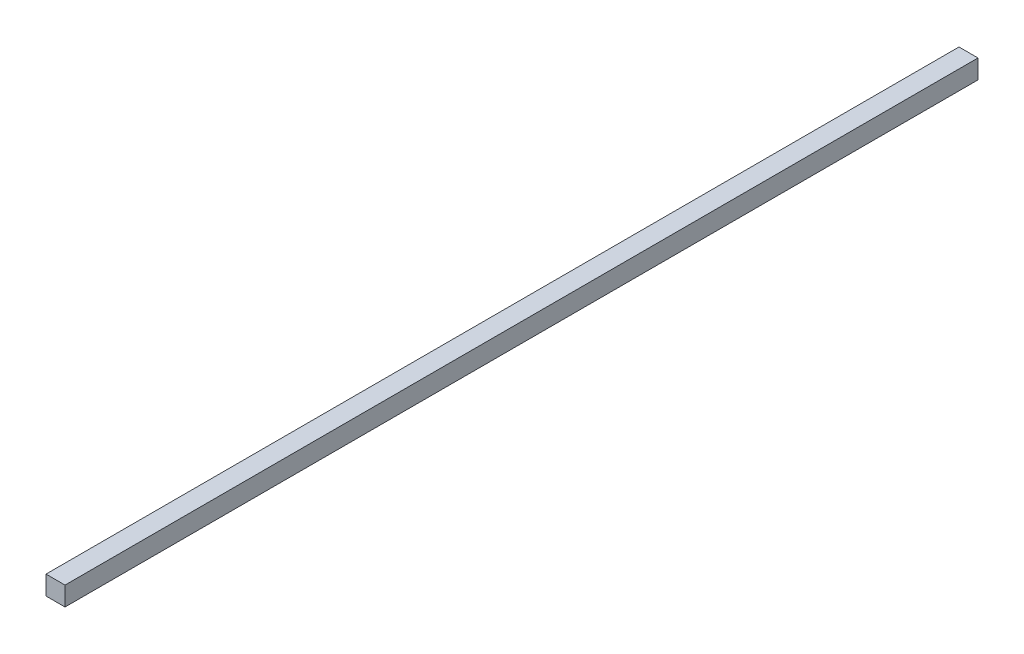
ISO-10303-21;
HEADER;
FILE_DESCRIPTION(('STEP AP214'),'2;1');
FILE_NAME('part.step','',(''),(''),'','','');
FILE_SCHEMA(('AUTOMOTIVE_DESIGN { 1 0 10303 214 1 1 1 1 }'));
ENDSEC;
DATA;
#1=APPLICATION_CONTEXT('core data for automotive mechanical design processes');
#2=APPLICATION_PROTOCOL_DEFINITION('international standard','automotive_design',2000,#1);
#3=PRODUCT_CONTEXT('',#1,'mechanical');
#4=PRODUCT('Part','Part','',(#3));
#5=PRODUCT_RELATED_PRODUCT_CATEGORY('part','',(#4));
#6=PRODUCT_DEFINITION_FORMATION('','',#4);
#7=PRODUCT_DEFINITION_CONTEXT('part definition',#1,'design');
#8=PRODUCT_DEFINITION('design','',#6,#7);
#9=PRODUCT_DEFINITION_SHAPE('','',#8);
#10=(LENGTH_UNIT() NAMED_UNIT(*) SI_UNIT(.MILLI.,.METRE.));
#11=(NAMED_UNIT(*) PLANE_ANGLE_UNIT() SI_UNIT($,.RADIAN.));
#12=(NAMED_UNIT(*) SI_UNIT($,.STERADIAN.) SOLID_ANGLE_UNIT());
#13=UNCERTAINTY_MEASURE_WITH_UNIT(LENGTH_MEASURE(1.E-05),#10,'distance_accuracy_value','');
#14=(GEOMETRIC_REPRESENTATION_CONTEXT(3) GLOBAL_UNCERTAINTY_ASSIGNED_CONTEXT((#13)) GLOBAL_UNIT_ASSIGNED_CONTEXT((#10,
#11,#12)) REPRESENTATION_CONTEXT('',''));
#15=CARTESIAN_POINT('',(0.,0.,0.));
#16=DIRECTION('',(0.,0.,1.));
#17=DIRECTION('',(1.,0.,0.));
#18=AXIS2_PLACEMENT_3D('',#15,#16,#17);
#19=CARTESIAN_POINT('',(1.58750000000007,1.58750000000002,152.4));
#20=DIRECTION('',(-1.00000000000003,0.,0.));
#21=DIRECTION('',(0.,-1.00000000000003,0.));
#22=AXIS2_PLACEMENT_3D('',#19,#20,#21);
#23=PLANE('',#22);
#24=DIRECTION('',(0.,1.00000000000003,0.));
#25=VECTOR('',#24,1.);
#26=CARTESIAN_POINT('',(1.58749999999991,1.58750000000063,6.93889390390723E-13));
#27=LINE('',#26,#25);
#28=CARTESIAN_POINT('',(1.58749999999952,-1.58749999999919,-1.49880108324396E-12));
#29=VERTEX_POINT('',#28);
#30=CARTESIAN_POINT('',(1.58749999999991,1.58750000000063,6.93889390390723E-13));
#31=VERTEX_POINT('',#30);
#32=EDGE_CURVE('E109',#29,#31,#27,.T.);
#33=ORIENTED_EDGE('',*,*,#32,.T.);
#34=DIRECTION('',(0.,0.,-1.));
#35=VECTOR('',#34,1.);
#36=CARTESIAN_POINT('',(1.58750000000007,1.58750000000002,152.4));
#37=LINE('',#36,#35);
#38=CARTESIAN_POINT('',(1.58750000000007,1.58750000000002,152.4));
#39=VERTEX_POINT('',#38);
#40=EDGE_CURVE('E11',#39,#31,#37,.T.);
#41=ORIENTED_EDGE('',*,*,#40,.F.);
#42=DIRECTION('',(0.,1.00000000000003,0.));
#43=VECTOR('',#42,1.);
#44=CARTESIAN_POINT('',(1.58750000000007,1.58750000000002,152.4));
#45=LINE('',#44,#43);
#46=CARTESIAN_POINT('',(1.58749999999958,-1.58749999999935,152.399999999999));
#47=VERTEX_POINT('',#46);
#48=EDGE_CURVE('E92',#47,#39,#45,.T.);
#49=ORIENTED_EDGE('',*,*,#48,.F.);
#50=DIRECTION('',(0.,0.,-1.));
#51=VECTOR('',#50,1.);
#52=CARTESIAN_POINT('',(1.58749999999958,-1.58749999999935,152.399999999999));
#53=LINE('',#52,#51);
#54=EDGE_CURVE('E105',#47,#29,#53,.T.);
#55=ORIENTED_EDGE('',*,*,#54,.T.);
#56=EDGE_LOOP('',(#33,#41,#49,#55));
#57=FACE_BOUND('',#56,.T.);
#58=ADVANCED_FACE('F40',(#57),#23,.F.);
#59=CARTESIAN_POINT('',(-1.58750000000046,1.58750000000019,152.4));
#60=DIRECTION('',(0.,-1.00000000000003,0.));
#61=DIRECTION('',(0.,0.,-1.));
#62=AXIS2_PLACEMENT_3D('',#59,#60,#61);
#63=PLANE('',#62);
#64=DIRECTION('',(-1.00000000000003,0.,0.));
#65=VECTOR('',#64,1.);
#66=CARTESIAN_POINT('',(-1.58750000000035,1.58750000000024,6.93889390390723E-13));
#67=LINE('',#66,#65);
#68=CARTESIAN_POINT('',(-1.58750000000035,1.58750000000024,6.93889390390723E-13));
#69=VERTEX_POINT('',#68);
#70=EDGE_CURVE('E97',#31,#69,#67,.T.);
#71=ORIENTED_EDGE('',*,*,#70,.T.);
#72=DIRECTION('',(0.,0.,-1.));
#73=VECTOR('',#72,1.);
#74=CARTESIAN_POINT('',(-1.58750000000046,1.58750000000019,152.4));
#75=LINE('',#74,#73);
#76=CARTESIAN_POINT('',(-1.58750000000046,1.58750000000019,152.4));
#77=VERTEX_POINT('',#76);
#78=EDGE_CURVE('E49',#77,#69,#75,.T.);
#79=ORIENTED_EDGE('',*,*,#78,.F.);
#80=DIRECTION('',(-1.00000000000003,0.,0.));
#81=VECTOR('',#80,1.);
#82=CARTESIAN_POINT('',(-1.58750000000046,1.58750000000019,152.4));
#83=LINE('',#82,#81);
#84=EDGE_CURVE('E87',#39,#77,#83,.T.);
#85=ORIENTED_EDGE('',*,*,#84,.F.);
#86=ORIENTED_EDGE('',*,*,#40,.T.);
#87=EDGE_LOOP('',(#71,#79,#85,#86));
#88=FACE_BOUND('',#87,.T.);
#89=ADVANCED_FACE('F96',(#88),#63,.F.);
#90=CARTESIAN_POINT('',(-1.58750000000046,1.58750000000019,152.4));
#91=DIRECTION('',(1.00000000000003,0.,0.));
#92=DIRECTION('',(0.,1.00000000000003,0.));
#93=AXIS2_PLACEMENT_3D('',#90,#91,#92);
#94=PLANE('',#93);
#95=DIRECTION('',(0.,-1.00000000000003,0.));
#96=VECTOR('',#95,1.);
#97=CARTESIAN_POINT('',(-1.58750000000035,1.58750000000024,6.93889390390723E-13));
#98=LINE('',#97,#96);
#99=CARTESIAN_POINT('',(-1.58750000000019,-1.58749999999938,0.));
#100=VERTEX_POINT('',#99);
#101=EDGE_CURVE('E74',#69,#100,#98,.T.);
#102=ORIENTED_EDGE('',*,*,#101,.T.);
#103=DIRECTION('',(0.,0.,-1.));
#104=VECTOR('',#103,1.);
#105=CARTESIAN_POINT('',(-1.58749999999985,-1.58749999999952,152.399999999999));
#106=LINE('',#105,#104);
#107=CARTESIAN_POINT('',(-1.58749999999985,-1.58749999999952,152.399999999999));
#108=VERTEX_POINT('',#107);
#109=EDGE_CURVE('E99',#108,#100,#106,.T.);
#110=ORIENTED_EDGE('',*,*,#109,.F.);
#111=DIRECTION('',(0.,-1.00000000000003,0.));
#112=VECTOR('',#111,1.);
#113=CARTESIAN_POINT('',(-1.58750000000046,1.58750000000019,152.4));
#114=LINE('',#113,#112);
#115=EDGE_CURVE('E90',#77,#108,#114,.T.);
#116=ORIENTED_EDGE('',*,*,#115,.F.);
#117=ORIENTED_EDGE('',*,*,#78,.T.);
#118=EDGE_LOOP('',(#102,#110,#116,#117));
#119=FACE_BOUND('',#118,.T.);
#120=ADVANCED_FACE('F100',(#119),#94,.F.);
#121=CARTESIAN_POINT('',(-1.58749999999985,-1.58749999999952,152.399999999999));
#122=DIRECTION('',(0.,1.00000000000003,0.));
#123=DIRECTION('',(0.,0.,1.));
#124=AXIS2_PLACEMENT_3D('',#121,#122,#123);
#125=PLANE('',#124);
#126=DIRECTION('',(1.00000000000003,0.,0.));
#127=VECTOR('',#126,1.);
#128=CARTESIAN_POINT('',(-1.58750000000019,-1.58749999999938,0.));
#129=LINE('',#128,#127);
#130=EDGE_CURVE('E80',#100,#29,#129,.T.);
#131=ORIENTED_EDGE('',*,*,#130,.T.);
#132=ORIENTED_EDGE('',*,*,#54,.F.);
#133=DIRECTION('',(1.00000000000003,0.,0.));
#134=VECTOR('',#133,1.);
#135=CARTESIAN_POINT('',(-1.58749999999985,-1.58749999999952,152.399999999999));
#136=LINE('',#135,#134);
#137=EDGE_CURVE('E57',#108,#47,#136,.T.);
#138=ORIENTED_EDGE('',*,*,#137,.F.);
#139=ORIENTED_EDGE('',*,*,#109,.T.);
#140=EDGE_LOOP('',(#131,#132,#138,#139));
#141=FACE_BOUND('',#140,.T.);
#142=ADVANCED_FACE('F123',(#141),#125,.F.);
#143=CARTESIAN_POINT('',(3.88578058618805E-13,2.22044604925031E-13,152.4));
#144=DIRECTION('',(0.,0.,1.));
#145=DIRECTION('',(1.00000000000003,0.,0.));
#146=AXIS2_PLACEMENT_3D('',#143,#144,#145);
#147=PLANE('',#146);
#148=ORIENTED_EDGE('',*,*,#48,.T.);
#149=ORIENTED_EDGE('',*,*,#84,.T.);
#150=ORIENTED_EDGE('',*,*,#115,.T.);
#151=ORIENTED_EDGE('',*,*,#137,.T.);
#152=EDGE_LOOP('',(#148,#149,#150,#151));
#153=FACE_BOUND('',#152,.T.);
#154=ADVANCED_FACE('F88',(#153),#147,.T.);
#155=CARTESIAN_POINT('',(0.,0.,0.));
#156=DIRECTION('',(0.,0.,1.));
#157=DIRECTION('',(1.00000000000003,0.,0.));
#158=AXIS2_PLACEMENT_3D('',#155,#156,#157);
#159=PLANE('',#158);
#160=ORIENTED_EDGE('',*,*,#32,.F.);
#161=ORIENTED_EDGE('',*,*,#130,.F.);
#162=ORIENTED_EDGE('',*,*,#101,.F.);
#163=ORIENTED_EDGE('',*,*,#70,.F.);
#164=EDGE_LOOP('',(#160,#161,#162,#163));
#165=FACE_BOUND('',#164,.T.);
#166=ADVANCED_FACE('F126',(#165),#159,.F.);
#167=CLOSED_SHELL('',(#58,#89,#120,#142,#154,#166));
#168=MANIFOLD_SOLID_BREP('B2',#167);
#169=ADVANCED_BREP_SHAPE_REPRESENTATION('',(#18,#168),#14);
#170=SHAPE_DEFINITION_REPRESENTATION(#9,#169);
ENDSEC;
END-ISO-10303-21;
